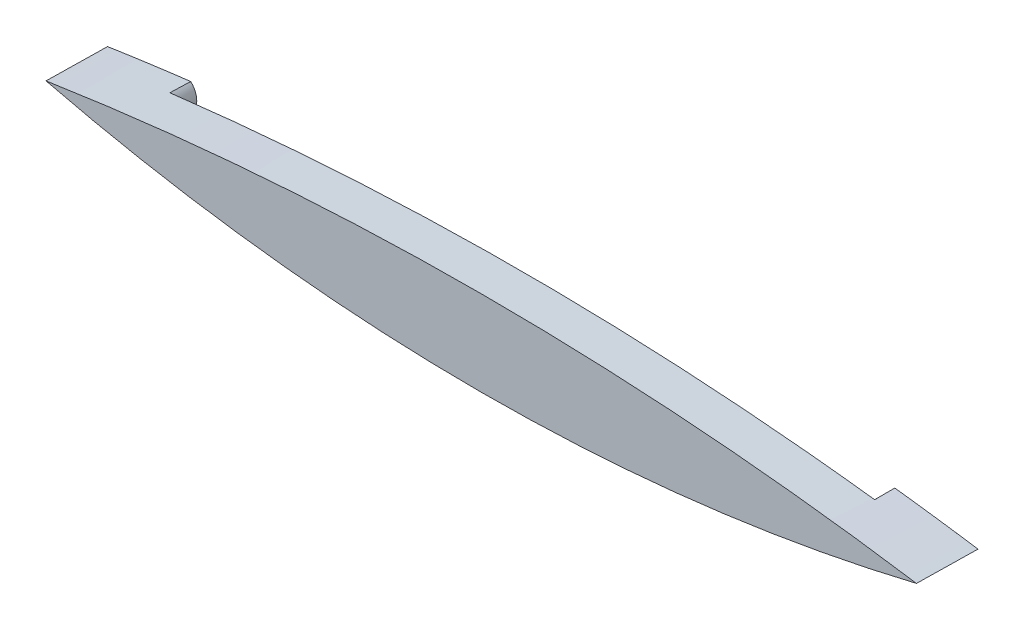
ISO-10303-21;
HEADER;
FILE_DESCRIPTION(('STEP AP214'),'2;1');
FILE_NAME('part.step','',(''),(''),'','','');
FILE_SCHEMA(('AUTOMOTIVE_DESIGN { 1 0 10303 214 1 1 1 1 }'));
ENDSEC;
DATA;
#1=APPLICATION_CONTEXT('core data for automotive mechanical design processes');
#2=APPLICATION_PROTOCOL_DEFINITION('international standard','automotive_design',2000,#1);
#3=PRODUCT_CONTEXT('',#1,'mechanical');
#4=PRODUCT('Part','Part','',(#3));
#5=PRODUCT_RELATED_PRODUCT_CATEGORY('part','',(#4));
#6=PRODUCT_DEFINITION_FORMATION('','',#4);
#7=PRODUCT_DEFINITION_CONTEXT('part definition',#1,'design');
#8=PRODUCT_DEFINITION('design','',#6,#7);
#9=PRODUCT_DEFINITION_SHAPE('','',#8);
#10=(LENGTH_UNIT() NAMED_UNIT(*) SI_UNIT(.MILLI.,.METRE.));
#11=(NAMED_UNIT(*) PLANE_ANGLE_UNIT() SI_UNIT($,.RADIAN.));
#12=(NAMED_UNIT(*) SI_UNIT($,.STERADIAN.) SOLID_ANGLE_UNIT());
#13=UNCERTAINTY_MEASURE_WITH_UNIT(LENGTH_MEASURE(1.E-05),#10,'distance_accuracy_value','');
#14=(GEOMETRIC_REPRESENTATION_CONTEXT(3) GLOBAL_UNCERTAINTY_ASSIGNED_CONTEXT((#13)) GLOBAL_UNIT_ASSIGNED_CONTEXT((#10,
#11,#12)) REPRESENTATION_CONTEXT('',''));
#15=CARTESIAN_POINT('',(0.,0.,0.));
#16=DIRECTION('',(0.,0.,1.));
#17=DIRECTION('',(1.,0.,0.));
#18=AXIS2_PLACEMENT_3D('',#15,#16,#17);
#19=CARTESIAN_POINT('',(21.,10.,-1.6));
#20=DIRECTION('',(-0.939692620785897,-0.342020143325699,0.));
#21=DIRECTION('',(0.342020143325699,-0.939692620785897,0.));
#22=AXIS2_PLACEMENT_3D('',#19,#20,#21);
#23=PLANE('',#22);
#24=DIRECTION('',(-0.342020143329004,0.939692620784695,0.));
#25=VECTOR('',#24,1.);
#26=CARTESIAN_POINT('',(18.8090813523357,16.0194995123191,-3.6));
#27=LINE('',#26,#25);
#28=CARTESIAN_POINT('',(18.8090813515931,16.0194995143594,-3.59999962505798));
#29=VERTEX_POINT('',#28);
#30=CARTESIAN_POINT('',(18.6258330537159,16.5229700749223,-3.60000000000163));
#31=VERTEX_POINT('',#30);
#32=EDGE_CURVE('E176',#29,#31,#27,.T.);
#33=ORIENTED_EDGE('',*,*,#32,.F.);
#34=CARTESIAN_POINT('',(18.8025452801784,16.037457222985,-2.5));
#35=CARTESIAN_POINT('',(18.8028176182289,16.0367089760441,-2.54583332276124));
#36=CARTESIAN_POINT('',(18.8030899560656,16.0359607302277,-2.59166664554211));
#37=CARTESIAN_POINT('',(18.8036346313114,16.0344642408442,-2.68333329114312));
#38=CARTESIAN_POINT('',(18.8039069687205,16.033715997277,-2.72916661396325));
#39=CARTESIAN_POINT('',(18.804451643111,16.0322195123917,-2.82083325964277));
#40=CARTESIAN_POINT('',(18.8047239800924,16.0314712710736,-2.86666658250216));
#41=CARTESIAN_POINT('',(18.8052686536276,16.0299747906866,-2.9583332282602));
#42=CARTESIAN_POINT('',(18.8055409901814,16.0292265516176,-3.00416655115884));
#43=CARTESIAN_POINT('',(18.8060856628613,16.0277300757288,-3.0958331969954));
#44=CARTESIAN_POINT('',(18.8063579989874,16.026981838909,-3.1416665199333));
#45=CARTESIAN_POINT('',(18.8069026708118,16.0254853675184,-3.23333316584838));
#46=CARTESIAN_POINT('',(18.8071750065102,16.0247371329477,-3.27916648882554));
#47=CARTESIAN_POINT('',(18.8077196774793,16.0232406660553,-3.37083313481913));
#48=CARTESIAN_POINT('',(18.80799201275,16.0224924337337,-3.41666645783555));
#49=CARTESIAN_POINT('',(18.8085366828637,16.0209959713395,-3.50833310390766));
#50=CARTESIAN_POINT('',(18.8088090177066,16.020247741267,-3.55416642696334));
#51=CARTESIAN_POINT('',(18.8090813523357,16.0194995123191,-3.59999975003865));
#52=B_SPLINE_CURVE_WITH_KNOTS('',3,(#34,#35,#36,#37,#38,#39,#40,#41,#42,#43,#44,#45,#46,#47,#48,
#49,#50,#51),.UNSPECIFIED.,.F.,.F.,(4,2,2,2,2,2,2,2,4),(0.,0.137520717172037,0.275041434344073,
0.412562151516109,0.550082868688145,0.687603585860182,0.825124303032218,0.962645020204255,
1.10016573737629),.UNSPECIFIED.);
#53=CARTESIAN_POINT('',(18.8025452801784,16.037457222985,-2.5));
#54=VERTEX_POINT('',#53);
#55=EDGE_CURVE('E183',#54,#29,#52,.T.);
#56=ORIENTED_EDGE('',*,*,#55,.F.);
#57=DIRECTION('',(0.342020143330147,-0.939692620784278,0.));
#58=VECTOR('',#57,1.);
#59=CARTESIAN_POINT('',(18.6258330537166,16.5229700749231,-2.5));
#60=LINE('',#59,#58);
#61=CARTESIAN_POINT('',(18.6258330537161,16.5229700749217,-2.5));
#62=VERTEX_POINT('',#61);
#63=EDGE_CURVE('E198',#62,#54,#60,.T.);
#64=ORIENTED_EDGE('',*,*,#63,.F.);
#65=DIRECTION('',(0.,0.,1.));
#66=VECTOR('',#65,1.);
#67=CARTESIAN_POINT('',(18.6258330537146,16.5229700749229,-3.795535764088));
#68=LINE('',#67,#66);
#69=EDGE_CURVE('E178',#31,#62,#68,.T.);
#70=ORIENTED_EDGE('',*,*,#69,.F.);
#71=EDGE_LOOP('',(#33,#56,#64,#70));
#72=FACE_BOUND('',#71,.T.);
#73=ADVANCED_FACE('F17',(#72),#23,.T.);
#74=CARTESIAN_POINT('',(-21.,10.,-1.6));
#75=DIRECTION('',(-0.939692620785897,0.342020143325699,0.));
#76=DIRECTION('',(-0.342020143325699,-0.939692620785897,0.));
#77=AXIS2_PLACEMENT_3D('',#74,#75,#76);
#78=PLANE('',#77);
#79=DIRECTION('',(0.,0.,-1.));
#80=VECTOR('',#79,1.);
#81=CARTESIAN_POINT('',(-18.6258330537155,16.5229700749206,-1.926636469844));
#82=LINE('',#81,#80);
#83=CARTESIAN_POINT('',(-18.6258330537164,16.5229700749195,-2.5));
#84=VERTEX_POINT('',#83);
#85=CARTESIAN_POINT('',(-18.6258330557022,16.5229700694635,-3.6));
#86=VERTEX_POINT('',#85);
#87=EDGE_CURVE('E98',#84,#86,#82,.T.);
#88=ORIENTED_EDGE('',*,*,#87,.F.);
#89=DIRECTION('',(0.342020143331867,0.939692620783653,0.));
#90=VECTOR('',#89,1.);
#91=CARTESIAN_POINT('',(-18.8025453015985,16.0374571641337,-2.5));
#92=LINE('',#91,#90);
#93=CARTESIAN_POINT('',(-18.8025453015986,16.0374571641336,-2.5));
#94=VERTEX_POINT('',#93);
#95=EDGE_CURVE('E95',#94,#84,#92,.T.);
#96=ORIENTED_EDGE('',*,*,#95,.F.);
#97=CARTESIAN_POINT('',(-18.8090813814413,16.0194994505452,-3.59999999999751));
#98=CARTESIAN_POINT('',(-18.8088090464921,16.0202476796149,-3.55416666650725));
#99=CARTESIAN_POINT('',(-18.8085367113289,16.0209959098092,-3.50833333303662));
#100=CARTESIAN_POINT('',(-18.8079920405748,16.0224923724468,-3.4166666661346));
#101=CARTESIAN_POINT('',(-18.8077197049838,16.0232406048902,-3.37083333270323));
#102=CARTESIAN_POINT('',(-18.8071750333743,16.0247370720261,-3.27916666587973));
#103=CARTESIAN_POINT('',(-18.8069026973557,16.0254853067186,-3.23333333248762));
#104=CARTESIAN_POINT('',(-18.8063580248908,16.0269817783527,-3.14166666574264));
#105=CARTESIAN_POINT('',(-18.8060856884444,16.0277300152943,-3.09583333238978));
#106=CARTESIAN_POINT('',(-18.805541015124,16.0292264914267,-3.00416666572332));
#107=CARTESIAN_POINT('',(-18.80526867825,16.0299747306174,-2.95833333240972));
#108=CARTESIAN_POINT('',(-18.8047240040743,16.031471211248,-2.86666666582178));
#109=CARTESIAN_POINT('',(-18.8044516667727,16.0322194526879,-2.82083333254743));
#110=CARTESIAN_POINT('',(-18.8039069917417,16.0337159378167,-2.72916666603801));
#111=CARTESIAN_POINT('',(-18.8036346540124,16.0344641815057,-2.68333333280293));
#112=CARTESIAN_POINT('',(-18.8030899781261,16.0359606711328,-2.59166666637202));
#113=CARTESIAN_POINT('',(-18.8028176399692,16.0367089170709,-2.54583333317619));
#114=CARTESIAN_POINT('',(-18.8025453015985,16.0374571641336,-2.5));
#115=B_SPLINE_CURVE_WITH_KNOTS('',3,(#97,#98,#99,#100,#101,#102,#103,#104,#105,#106,#107,#108,
#109,#110,#111,#112,#113,#114),.UNSPECIFIED.,.F.,.F.,(4,2,2,2,2,2,2,2,4),(0.,0.13752074842385,
0.275041496847701,0.412562245271552,0.550082993695402,0.687603742119252,0.825124490543104,
0.962645238966953,1.1001659873908),.UNSPECIFIED.);
#116=CARTESIAN_POINT('',(-18.8090813876344,16.0194994517231,-3.59999999999689));
#117=VERTEX_POINT('',#116);
#118=EDGE_CURVE('E88',#117,#94,#115,.T.);
#119=ORIENTED_EDGE('',*,*,#118,.F.);
#120=DIRECTION('',(0.342020154243983,0.939692616811967,0.));
#121=VECTOR('',#120,1.);
#122=CARTESIAN_POINT('',(-18.8090813814413,16.0194994505452,-3.6));
#123=LINE('',#122,#121);
#124=EDGE_CURVE('E190',#117,#86,#123,.T.);
#125=ORIENTED_EDGE('',*,*,#124,.T.);
#126=EDGE_LOOP('',(#88,#96,#119,#125));
#127=FACE_BOUND('',#126,.T.);
#128=ADVANCED_FACE('F125',(#127),#78,.F.);
#129=CARTESIAN_POINT('',(0.,0.,-2.5));
#130=DIRECTION('',(0.,0.,-1.));
#131=DIRECTION('',(-1.,0.,0.));
#132=AXIS2_PLACEMENT_3D('',#129,#130,#131);
#133=PLANE('',#132);
#134=ORIENTED_EDGE('',*,*,#95,.T.);
#135=CARTESIAN_POINT('',(-19.5655256745,16.86499021825,-2.5));
#136=DIRECTION('',(0.,0.,-1.));
#137=DIRECTION('',(-1.,0.,0.));
#138=AXIS2_PLACEMENT_3D('',#135,#136,#137);
#139=CIRCLE('',#138,1.);
#140=CARTESIAN_POINT('',(-18.9086707151305,17.6190071692211,-2.5));
#141=VERTEX_POINT('',#140);
#142=EDGE_CURVE('E92',#141,#84,#139,.T.);
#143=ORIENTED_EDGE('',*,*,#142,.F.);
#144=CARTESIAN_POINT('',(-1.00203503480834E-07,-137.532878857641,-2.5));
#145=DIRECTION('',(0.,0.,-1.));
#146=DIRECTION('',(0.,1.,0.));
#147=AXIS2_PLACEMENT_3D('',#144,#145,#146);
#148=ELLIPSE('',#147,156.3002063226,156.27640104412);
#149=CARTESIAN_POINT('',(18.9086706905282,17.619007147789,-2.5));
#150=VERTEX_POINT('',#149);
#151=EDGE_CURVE('E78',#150,#141,#148,.F.);
#152=ORIENTED_EDGE('',*,*,#151,.F.);
#153=CARTESIAN_POINT('',(19.5655256745,16.86499021825,-2.5));
#154=DIRECTION('',(0.,0.,1.));
#155=DIRECTION('',(1.,0.,0.));
#156=AXIS2_PLACEMENT_3D('',#153,#154,#155);
#157=CIRCLE('',#156,1.);
#158=EDGE_CURVE('E180',#62,#150,#157,.F.);
#159=ORIENTED_EDGE('',*,*,#158,.F.);
#160=ORIENTED_EDGE('',*,*,#63,.T.);
#161=CARTESIAN_POINT('',(-1.65484938252636E-07,114.966325460229,-2.5));
#162=DIRECTION('',(0.,0.,-1.));
#163=DIRECTION('',(0.,1.,0.));
#164=AXIS2_PLACEMENT_3D('',#161,#162,#163);
#165=ELLIPSE('',#164,100.700369418139,100.685032264123);
#166=EDGE_CURVE('E200',#94,#54,#165,.F.);
#167=ORIENTED_EDGE('',*,*,#166,.F.);
#168=EDGE_LOOP('',(#134,#143,#152,#159,#160,#167));
#169=FACE_BOUND('',#168,.T.);
#170=ADVANCED_FACE('F93',(#169),#133,.T.);
#171=CARTESIAN_POINT('',(-19.5655256745,16.86499021825,-1.926636469844));
#172=DIRECTION('',(0.,0.,-1.));
#173=DIRECTION('',(-1.,0.,0.));
#174=AXIS2_PLACEMENT_3D('',#171,#172,#173);
#175=CYLINDRICAL_SURFACE('',#174,1.);
#176=CARTESIAN_POINT('',(-19.5655256745,16.86499021825,-3.6));
#177=DIRECTION('',(0.,0.,-1.));
#178=DIRECTION('',(-1.,0.,0.));
#179=AXIS2_PLACEMENT_3D('',#176,#177,#178);
#180=CIRCLE('',#179,1.);
#181=CARTESIAN_POINT('',(-18.8897639349056,17.6021103382442,-3.59999995830637));
#182=VERTEX_POINT('',#181);
#183=EDGE_CURVE('E102',#86,#182,#180,.F.);
#184=ORIENTED_EDGE('',*,*,#183,.T.);
#185=CARTESIAN_POINT('',(-18.9086707151306,17.6190071692212,-2.5));
#186=CARTESIAN_POINT('',(-18.9054490346111,17.616199840916,-2.68333224214254));
#187=CARTESIAN_POINT('',(-18.902262629391,17.6133881075689,-2.86666502293153));
#188=CARTESIAN_POINT('',(-18.8959603695496,17.6077558307907,-3.23333166180244));
#189=CARTESIAN_POINT('',(-18.8928445149283,17.6049352873597,-3.41666551988435));
#190=CARTESIAN_POINT('',(-18.8897639356064,17.6021103388867,-3.59999991661273));
#191=B_SPLINE_CURVE_WITH_KNOTS('',3,(#185,#186,#187,#188,#189,#190),.UNSPECIFIED.,.F.,.F.,(4,2,
4),(0.,0.550146078610216,1.10029215722045),.UNSPECIFIED.);
#192=EDGE_CURVE('E82',#141,#182,#191,.T.);
#193=ORIENTED_EDGE('',*,*,#192,.F.);
#194=ORIENTED_EDGE('',*,*,#142,.T.);
#195=ORIENTED_EDGE('',*,*,#87,.T.);
#196=EDGE_LOOP('',(#184,#193,#194,#195));
#197=FACE_BOUND('',#196,.T.);
#198=ADVANCED_FACE('F100',(#197),#175,.T.);
#199=CARTESIAN_POINT('',(0.,0.,-3.6));
#200=DIRECTION('',(0.,0.,1.));
#201=DIRECTION('',(1.,0.,0.));
#202=AXIS2_PLACEMENT_3D('',#199,#200,#201);
#203=PLANE('',#202);
#204=ORIENTED_EDGE('',*,*,#183,.F.);
#205=ORIENTED_EDGE('',*,*,#124,.F.);
#206=CARTESIAN_POINT('',(-1.65484938252636E-07,114.947124888808,-3.6));
#207=DIRECTION('',(0.,0.,1.));
#208=DIRECTION('',(0.,1.,0.));
#209=AXIS2_PLACEMENT_3D('',#206,#207,#208);
#210=ELLIPSE('',#209,100.700369418139,100.685032264123);
#211=CARTESIAN_POINT('',(-23.3536948851409,16.9930378208812,-3.6));
#212=VERTEX_POINT('',#211);
#213=EDGE_CURVE('E202',#212,#117,#210,.T.);
#214=ORIENTED_EDGE('',*,*,#213,.F.);
#215=CARTESIAN_POINT('',(-1.00203503480834E-07,-137.552079429062,-3.6));
#216=DIRECTION('',(0.,0.,1.));
#217=DIRECTION('',(0.,1.,0.));
#218=AXIS2_PLACEMENT_3D('',#215,#216,#217);
#219=ELLIPSE('',#218,156.3002063226,156.27640104412);
#220=EDGE_CURVE('E104',#182,#212,#219,.T.);
#221=ORIENTED_EDGE('',*,*,#220,.F.);
#222=EDGE_LOOP('',(#204,#205,#214,#221));
#223=FACE_BOUND('',#222,.T.);
#224=ADVANCED_FACE('F122',(#223),#203,.F.);
#225=CARTESIAN_POINT('',(0.,0.,-3.6));
#226=DIRECTION('',(0.,0.,-1.));
#227=DIRECTION('',(-1.,0.,0.));
#228=AXIS2_PLACEMENT_3D('',#225,#226,#227);
#229=PLANE('',#228);
#230=CARTESIAN_POINT('',(-1.00203503480834E-07,-137.552079429062,-3.6));
#231=DIRECTION('',(0.,0.,-1.));
#232=DIRECTION('',(0.,1.,0.));
#233=AXIS2_PLACEMENT_3D('',#230,#231,#232);
#234=ELLIPSE('',#233,156.3002063226,156.27640104412);
#235=CARTESIAN_POINT('',(23.353694333315,16.9930378740012,-3.6));
#236=VERTEX_POINT('',#235);
#237=CARTESIAN_POINT('',(18.8897639198979,17.6021103154808,-3.600000000003));
#238=VERTEX_POINT('',#237);
#239=EDGE_CURVE('E147',#236,#238,#234,.F.);
#240=ORIENTED_EDGE('',*,*,#239,.F.);
#241=CARTESIAN_POINT('',(-1.65484938252636E-07,114.947124888808,-3.6));
#242=DIRECTION('',(0.,0.,-1.));
#243=DIRECTION('',(0.,1.,0.));
#244=AXIS2_PLACEMENT_3D('',#241,#242,#243);
#245=ELLIPSE('',#244,100.700369418139,100.685032264123);
#246=EDGE_CURVE('E172',#29,#236,#245,.F.);
#247=ORIENTED_EDGE('',*,*,#246,.F.);
#248=ORIENTED_EDGE('',*,*,#32,.T.);
#249=CARTESIAN_POINT('',(19.5655256745,16.86499021825,-3.60000000000163));
#250=DIRECTION('',(0.,0.,1.));
#251=DIRECTION('',(1.,0.,0.));
#252=AXIS2_PLACEMENT_3D('',#249,#250,#251);
#253=CIRCLE('',#252,1.);
#254=EDGE_CURVE('E174',#238,#31,#253,.T.);
#255=ORIENTED_EDGE('',*,*,#254,.F.);
#256=EDGE_LOOP('',(#240,#247,#248,#255));
#257=FACE_BOUND('',#256,.T.);
#258=ADVANCED_FACE('F161',(#257),#229,.T.);
#259=CARTESIAN_POINT('',(19.5655256745,16.86499021825,-3.795535764088));
#260=DIRECTION('',(0.,0.,1.));
#261=DIRECTION('',(1.,0.,0.));
#262=AXIS2_PLACEMENT_3D('',#259,#260,#261);
#263=CYLINDRICAL_SURFACE('',#262,1.);
#264=ORIENTED_EDGE('',*,*,#158,.T.);
#265=CARTESIAN_POINT('',(18.8897639127599,17.6021103096685,-3.59999999964919));
#266=CARTESIAN_POINT('',(18.8928444911012,17.6049352615708,-3.41666558910248));
#267=CARTESIAN_POINT('',(18.8959603450859,17.6077558073653,-3.23333171719165));
#268=CARTESIAN_POINT('',(18.902262604342,17.6133880867388,-2.86666505064193));
#269=CARTESIAN_POINT('',(18.9054490096134,17.6161998203178,-2.68333225600303));
#270=CARTESIAN_POINT('',(18.9086706905282,17.619007147789,-2.5));
#271=B_SPLINE_CURVE_WITH_KNOTS('',3,(#265,#266,#267,#268,#269,#270),.UNSPECIFIED.,.F.,.F.,(4,2,
4),(0.,0.550146120162673,1.10029224032479),.UNSPECIFIED.);
#272=EDGE_CURVE('E85',#238,#150,#271,.T.);
#273=ORIENTED_EDGE('',*,*,#272,.F.);
#274=ORIENTED_EDGE('',*,*,#254,.T.);
#275=ORIENTED_EDGE('',*,*,#69,.T.);
#276=EDGE_LOOP('',(#264,#273,#274,#275));
#277=FACE_BOUND('',#276,.T.);
#278=ADVANCED_FACE('F158',(#277),#263,.T.);
#279=CARTESIAN_POINT('',(-1.65484938252636E-07,114.810421360477,-11.4317398928855));
#280=DIRECTION('',(0.,0.0174524064372799,0.999847695156391));
#281=DIRECTION('',(0.,-0.999847695156391,0.0174524064372799));
#282=AXIS2_PLACEMENT_3D('',#279,#280,#281);
#283=CYLINDRICAL_SURFACE('',#282,100.685032264123);
#284=ORIENTED_EDGE('',*,*,#213,.T.);
#285=ORIENTED_EDGE('',*,*,#118,.T.);
#286=ORIENTED_EDGE('',*,*,#166,.T.);
#287=ORIENTED_EDGE('',*,*,#55,.T.);
#288=ORIENTED_EDGE('',*,*,#246,.T.);
#289=DIRECTION('',(0.,0.0174524064372799,0.999847695156391));
#290=VECTOR('',#289,1.);
#291=CARTESIAN_POINT('',(23.3536940618086,16.8861698782873,-9.7224657252171));
#292=LINE('',#291,#290);
#293=CARTESIAN_POINT('',(23.3536943333149,17.0506811181865,-0.297620752350986));
#294=VERTEX_POINT('',#293);
#295=EDGE_CURVE('E142',#294,#236,#292,.F.);
#296=ORIENTED_EDGE('',*,*,#295,.F.);
#297=CARTESIAN_POINT('',(-1.65484938252636E-07,114.974932641378,-2.00689492226622));
#298=DIRECTION('',(0.,0.0174524064372799,0.999847695156391));
#299=DIRECTION('',(0.,-0.999847695156391,0.0174524064372799));
#300=AXIS2_PLACEMENT_3D('',#297,#298,#299);
#301=CIRCLE('',#300,100.685032264123);
#302=CARTESIAN_POINT('',(-23.353611984181,17.050677442321,-0.297620685810353));
#303=VERTEX_POINT('',#302);
#304=EDGE_CURVE('E26',#294,#303,#301,.F.);
#305=ORIENTED_EDGE('',*,*,#304,.T.);
#306=DIRECTION('',(0.,0.0174524064372799,0.999847695156391));
#307=VECTOR('',#306,1.);
#308=CARTESIAN_POINT('',(-23.353694885141,16.9930378223242,-3.59999991733298));
#309=LINE('',#308,#307);
#310=EDGE_CURVE('E106',#212,#303,#309,.T.);
#311=ORIENTED_EDGE('',*,*,#310,.F.);
#312=EDGE_LOOP('',(#284,#285,#286,#287,#288,#296,#305,#311));
#313=FACE_BOUND('',#312,.T.);
#314=ADVANCED_FACE('F139',(#313),#283,.T.);
#315=CARTESIAN_POINT('',(-1.00203503480834E-07,-137.611875110908,-7.02569231864859));
#316=DIRECTION('',(0.,0.0174524064372799,0.999847695156391));
#317=DIRECTION('',(0.,-0.999847695156391,0.0174524064372799));
#318=AXIS2_PLACEMENT_3D('',#315,#316,#317);
#319=CYLINDRICAL_SURFACE('',#318,156.27640104412);
#320=ORIENTED_EDGE('',*,*,#239,.T.);
#321=ORIENTED_EDGE('',*,*,#272,.T.);
#322=ORIENTED_EDGE('',*,*,#151,.T.);
#323=ORIENTED_EDGE('',*,*,#192,.T.);
#324=ORIENTED_EDGE('',*,*,#220,.T.);
#325=ORIENTED_EDGE('',*,*,#310,.T.);
#326=CARTESIAN_POINT('',(-1.00203503480834E-07,-137.447363829969,2.39915265417641));
#327=DIRECTION('',(0.,0.0174524064372799,0.999847695156391));
#328=DIRECTION('',(0.,-0.999847695156391,0.0174524064372799));
#329=AXIS2_PLACEMENT_3D('',#326,#327,#328);
#330=CIRCLE('',#329,156.27640104412);
#331=EDGE_CURVE('E11',#303,#294,#330,.F.);
#332=ORIENTED_EDGE('',*,*,#331,.T.);
#333=ORIENTED_EDGE('',*,*,#295,.T.);
#334=EDGE_LOOP('',(#320,#321,#322,#323,#324,#325,#332,#333));
#335=FACE_BOUND('',#334,.T.);
#336=ADVANCED_FACE('F80',(#335),#319,.T.);
#337=CARTESIAN_POINT('',(63.3910084812,0.,0.));
#338=DIRECTION('',(0.,-0.0174524064372799,-0.999847695156391));
#339=DIRECTION('',(0.,0.999847695156391,-0.0174524064372799));
#340=AXIS2_PLACEMENT_3D('',#337,#338,#339);
#341=PLANE('',#340);
#342=ORIENTED_EDGE('',*,*,#331,.F.);
#343=ORIENTED_EDGE('',*,*,#304,.F.);
#344=EDGE_LOOP('',(#342,#343));
#345=FACE_BOUND('',#344,.T.);
#346=ADVANCED_FACE('F133',(#345),#341,.F.);
#347=CLOSED_SHELL('',(#73,#128,#170,#198,#224,#258,#278,#314,#336,#346));
#348=MANIFOLD_SOLID_BREP('B1',#347);
#349=ADVANCED_BREP_SHAPE_REPRESENTATION('',(#18,#348),#14);
#350=SHAPE_DEFINITION_REPRESENTATION(#9,#349);
ENDSEC;
END-ISO-10303-21;
